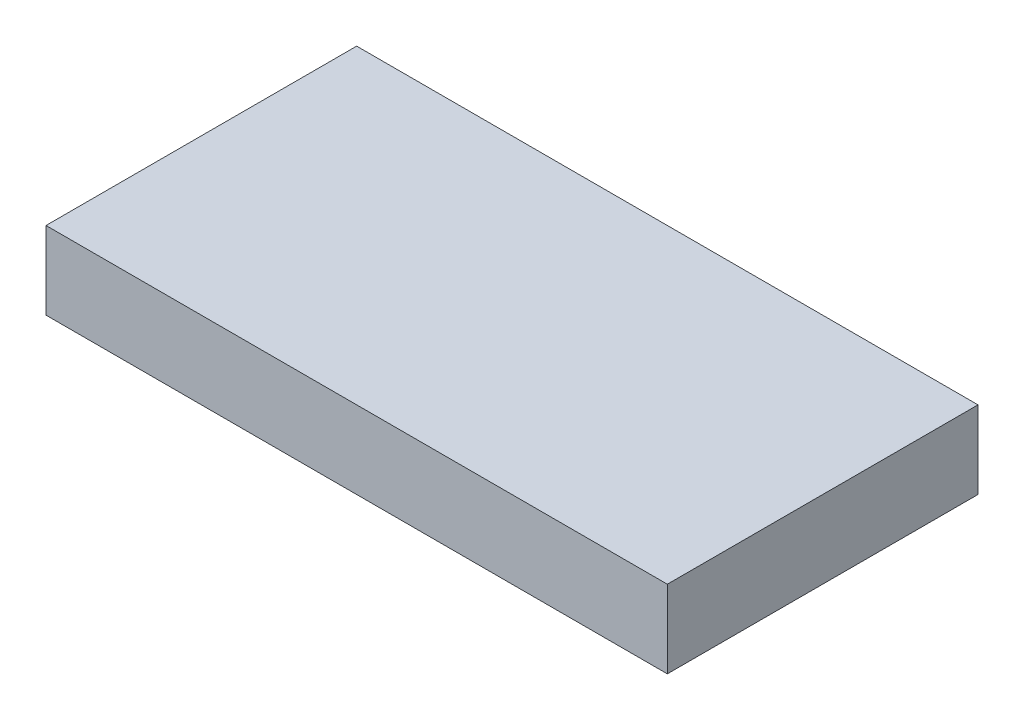
ISO-10303-21;
HEADER;
FILE_DESCRIPTION(('STEP AP214'),'2;1');
FILE_NAME('part.step','',(''),(''),'','','');
FILE_SCHEMA(('AUTOMOTIVE_DESIGN { 1 0 10303 214 1 1 1 1 }'));
ENDSEC;
DATA;
#1=APPLICATION_CONTEXT('core data for automotive mechanical design processes');
#2=APPLICATION_PROTOCOL_DEFINITION('international standard','automotive_design',2000,#1);
#3=PRODUCT_CONTEXT('',#1,'mechanical');
#4=PRODUCT('Part','Part','',(#3));
#5=PRODUCT_RELATED_PRODUCT_CATEGORY('part','',(#4));
#6=PRODUCT_DEFINITION_FORMATION('','',#4);
#7=PRODUCT_DEFINITION_CONTEXT('part definition',#1,'design');
#8=PRODUCT_DEFINITION('design','',#6,#7);
#9=PRODUCT_DEFINITION_SHAPE('','',#8);
#10=(LENGTH_UNIT() NAMED_UNIT(*) SI_UNIT(.MILLI.,.METRE.));
#11=(NAMED_UNIT(*) PLANE_ANGLE_UNIT() SI_UNIT($,.RADIAN.));
#12=(NAMED_UNIT(*) SI_UNIT($,.STERADIAN.) SOLID_ANGLE_UNIT());
#13=UNCERTAINTY_MEASURE_WITH_UNIT(LENGTH_MEASURE(1.E-05),#10,'distance_accuracy_value','');
#14=(GEOMETRIC_REPRESENTATION_CONTEXT(3) GLOBAL_UNCERTAINTY_ASSIGNED_CONTEXT((#13)) GLOBAL_UNIT_ASSIGNED_CONTEXT((#10,
#11,#12)) REPRESENTATION_CONTEXT('',''));
#15=CARTESIAN_POINT('',(0.,0.,0.));
#16=DIRECTION('',(0.,0.,1.));
#17=DIRECTION('',(1.,0.,0.));
#18=AXIS2_PLACEMENT_3D('',#15,#16,#17);
#19=CARTESIAN_POINT('',(-39.7747252747253,6.35,12.4906593406593));
#20=DIRECTION('',(1.,0.,0.));
#21=DIRECTION('',(0.,0.,-1.));
#22=AXIS2_PLACEMENT_3D('',#19,#20,#21);
#23=PLANE('',#22);
#24=DIRECTION('',(0.,0.,1.));
#25=VECTOR('',#24,1.);
#26=CARTESIAN_POINT('',(-39.7747252747253,0.,12.4906593406593));
#27=LINE('',#26,#25);
#28=CARTESIAN_POINT('',(-39.7747252747253,0.,-12.9093406593407));
#29=VERTEX_POINT('',#28);
#30=CARTESIAN_POINT('',(-39.7747252747253,0.,12.4906593406593));
#31=VERTEX_POINT('',#30);
#32=EDGE_CURVE('E107',#29,#31,#27,.T.);
#33=ORIENTED_EDGE('',*,*,#32,.T.);
#34=DIRECTION('',(0.,-1.,0.));
#35=VECTOR('',#34,1.);
#36=CARTESIAN_POINT('',(-39.7747252747253,6.35,12.4906593406593));
#37=LINE('',#36,#35);
#38=CARTESIAN_POINT('',(-39.7747252747253,6.35,12.4906593406593));
#39=VERTEX_POINT('',#38);
#40=EDGE_CURVE('E11',#39,#31,#37,.T.);
#41=ORIENTED_EDGE('',*,*,#40,.F.);
#42=DIRECTION('',(0.,0.,1.));
#43=VECTOR('',#42,1.);
#44=CARTESIAN_POINT('',(-39.7747252747253,6.35,12.4906593406593));
#45=LINE('',#44,#43);
#46=CARTESIAN_POINT('',(-39.7747252747253,6.35,-12.9093406593407));
#47=VERTEX_POINT('',#46);
#48=EDGE_CURVE('E91',#47,#39,#45,.T.);
#49=ORIENTED_EDGE('',*,*,#48,.F.);
#50=DIRECTION('',(0.,-1.,0.));
#51=VECTOR('',#50,1.);
#52=CARTESIAN_POINT('',(-39.7747252747253,6.35,-12.9093406593407));
#53=LINE('',#52,#51);
#54=EDGE_CURVE('E103',#47,#29,#53,.T.);
#55=ORIENTED_EDGE('',*,*,#54,.T.);
#56=EDGE_LOOP('',(#33,#41,#49,#55));
#57=FACE_BOUND('',#56,.T.);
#58=ADVANCED_FACE('F39',(#57),#23,.F.);
#59=CARTESIAN_POINT('',(-39.7747252747253,6.35,12.4906593406593));
#60=DIRECTION('',(0.,0.,-1.));
#61=DIRECTION('',(-1.,0.,0.));
#62=AXIS2_PLACEMENT_3D('',#59,#60,#61);
#63=PLANE('',#62);
#64=DIRECTION('',(1.,0.,0.));
#65=VECTOR('',#64,1.);
#66=CARTESIAN_POINT('',(-39.7747252747253,0.,12.4906593406593));
#67=LINE('',#66,#65);
#68=CARTESIAN_POINT('',(11.0252747252747,0.,12.4906593406593));
#69=VERTEX_POINT('',#68);
#70=EDGE_CURVE('E96',#31,#69,#67,.T.);
#71=ORIENTED_EDGE('',*,*,#70,.T.);
#72=DIRECTION('',(0.,-1.,0.));
#73=VECTOR('',#72,1.);
#74=CARTESIAN_POINT('',(11.0252747252747,6.35,12.4906593406593));
#75=LINE('',#74,#73);
#76=CARTESIAN_POINT('',(11.0252747252747,6.35,12.4906593406593));
#77=VERTEX_POINT('',#76);
#78=EDGE_CURVE('E48',#77,#69,#75,.T.);
#79=ORIENTED_EDGE('',*,*,#78,.F.);
#80=DIRECTION('',(1.,0.,0.));
#81=VECTOR('',#80,1.);
#82=CARTESIAN_POINT('',(-39.7747252747253,6.35,12.4906593406593));
#83=LINE('',#82,#81);
#84=EDGE_CURVE('E86',#39,#77,#83,.T.);
#85=ORIENTED_EDGE('',*,*,#84,.F.);
#86=ORIENTED_EDGE('',*,*,#40,.T.);
#87=EDGE_LOOP('',(#71,#79,#85,#86));
#88=FACE_BOUND('',#87,.T.);
#89=ADVANCED_FACE('F95',(#88),#63,.F.);
#90=CARTESIAN_POINT('',(11.0252747252747,6.35,12.4906593406593));
#91=DIRECTION('',(-1.,0.,0.));
#92=DIRECTION('',(0.,0.,1.));
#93=AXIS2_PLACEMENT_3D('',#90,#91,#92);
#94=PLANE('',#93);
#95=DIRECTION('',(0.,0.,-1.));
#96=VECTOR('',#95,1.);
#97=CARTESIAN_POINT('',(11.0252747252747,0.,12.4906593406593));
#98=LINE('',#97,#96);
#99=CARTESIAN_POINT('',(11.0252747252747,0.,-12.9093406593407));
#100=VERTEX_POINT('',#99);
#101=EDGE_CURVE('E73',#69,#100,#98,.T.);
#102=ORIENTED_EDGE('',*,*,#101,.T.);
#103=DIRECTION('',(0.,-1.,0.));
#104=VECTOR('',#103,1.);
#105=CARTESIAN_POINT('',(11.0252747252747,6.35,-12.9093406593407));
#106=LINE('',#105,#104);
#107=CARTESIAN_POINT('',(11.0252747252747,6.35,-12.9093406593407));
#108=VERTEX_POINT('',#107);
#109=EDGE_CURVE('E98',#108,#100,#106,.T.);
#110=ORIENTED_EDGE('',*,*,#109,.F.);
#111=DIRECTION('',(0.,0.,-1.));
#112=VECTOR('',#111,1.);
#113=CARTESIAN_POINT('',(11.0252747252747,6.35,12.4906593406593));
#114=LINE('',#113,#112);
#115=EDGE_CURVE('E89',#77,#108,#114,.T.);
#116=ORIENTED_EDGE('',*,*,#115,.F.);
#117=ORIENTED_EDGE('',*,*,#78,.T.);
#118=EDGE_LOOP('',(#102,#110,#116,#117));
#119=FACE_BOUND('',#118,.T.);
#120=ADVANCED_FACE('F99',(#119),#94,.F.);
#121=CARTESIAN_POINT('',(-39.7747252747253,6.35,-12.9093406593407));
#122=DIRECTION('',(0.,0.,1.));
#123=DIRECTION('',(1.,0.,0.));
#124=AXIS2_PLACEMENT_3D('',#121,#122,#123);
#125=PLANE('',#124);
#126=DIRECTION('',(-1.,0.,0.));
#127=VECTOR('',#126,1.);
#128=CARTESIAN_POINT('',(-39.7747252747253,0.,-12.9093406593407));
#129=LINE('',#128,#127);
#130=EDGE_CURVE('E79',#100,#29,#129,.T.);
#131=ORIENTED_EDGE('',*,*,#130,.T.);
#132=ORIENTED_EDGE('',*,*,#54,.F.);
#133=DIRECTION('',(-1.,0.,0.));
#134=VECTOR('',#133,1.);
#135=CARTESIAN_POINT('',(-39.7747252747253,6.35,-12.9093406593407));
#136=LINE('',#135,#134);
#137=EDGE_CURVE('E56',#108,#47,#136,.T.);
#138=ORIENTED_EDGE('',*,*,#137,.F.);
#139=ORIENTED_EDGE('',*,*,#109,.T.);
#140=EDGE_LOOP('',(#131,#132,#138,#139));
#141=FACE_BOUND('',#140,.T.);
#142=ADVANCED_FACE('F120',(#141),#125,.F.);
#143=CARTESIAN_POINT('',(0.,6.35,0.));
#144=DIRECTION('',(0.,-1.,0.));
#145=DIRECTION('',(0.,0.,-1.));
#146=AXIS2_PLACEMENT_3D('',#143,#144,#145);
#147=PLANE('',#146);
#148=ORIENTED_EDGE('',*,*,#48,.T.);
#149=ORIENTED_EDGE('',*,*,#84,.T.);
#150=ORIENTED_EDGE('',*,*,#115,.T.);
#151=ORIENTED_EDGE('',*,*,#137,.T.);
#152=EDGE_LOOP('',(#148,#149,#150,#151));
#153=FACE_BOUND('',#152,.T.);
#154=ADVANCED_FACE('F87',(#153),#147,.F.);
#155=CARTESIAN_POINT('',(0.,0.,0.));
#156=DIRECTION('',(0.,-1.,0.));
#157=DIRECTION('',(0.,0.,-1.));
#158=AXIS2_PLACEMENT_3D('',#155,#156,#157);
#159=PLANE('',#158);
#160=ORIENTED_EDGE('',*,*,#32,.F.);
#161=ORIENTED_EDGE('',*,*,#130,.F.);
#162=ORIENTED_EDGE('',*,*,#101,.F.);
#163=ORIENTED_EDGE('',*,*,#70,.F.);
#164=EDGE_LOOP('',(#160,#161,#162,#163));
#165=FACE_BOUND('',#164,.T.);
#166=ADVANCED_FACE('F123',(#165),#159,.T.);
#167=CLOSED_SHELL('',(#58,#89,#120,#142,#154,#166));
#168=MANIFOLD_SOLID_BREP('B2',#167);
#169=ADVANCED_BREP_SHAPE_REPRESENTATION('',(#18,#168),#14);
#170=SHAPE_DEFINITION_REPRESENTATION(#9,#169);
ENDSEC;
END-ISO-10303-21;
